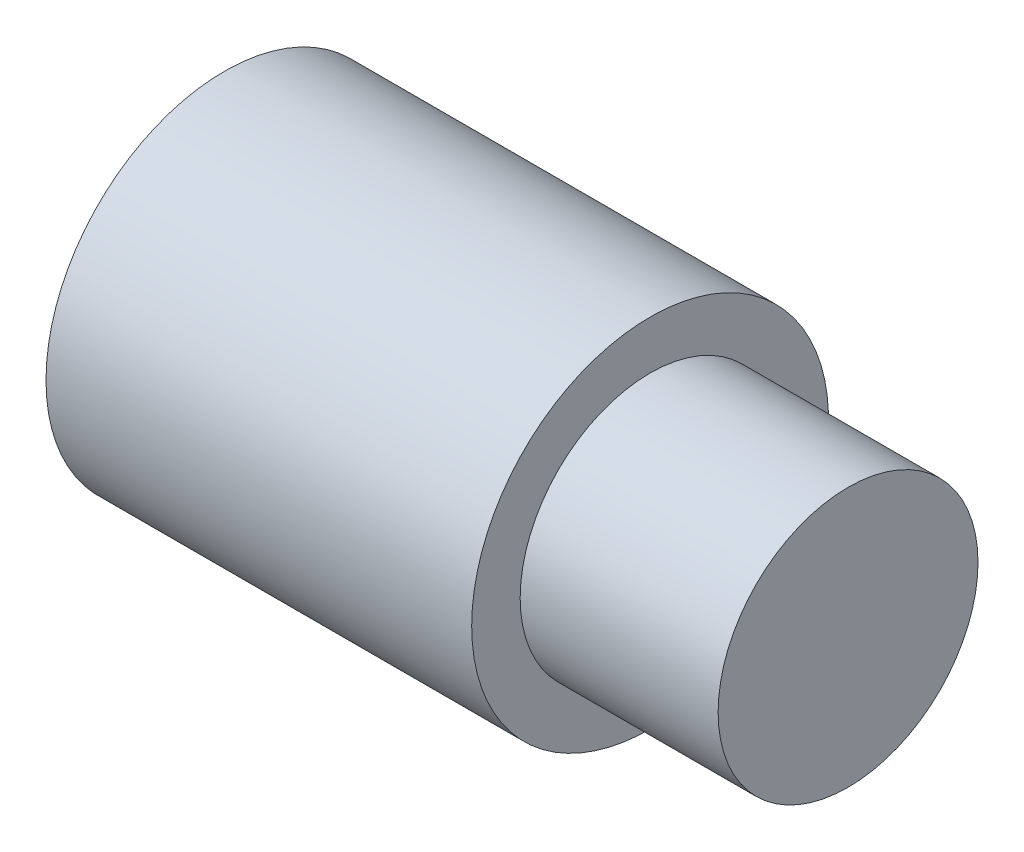
ISO-10303-21;
HEADER;
FILE_DESCRIPTION(('STEP AP214'),'2;1');
FILE_NAME('part.step','',(''),(''),'','','');
FILE_SCHEMA(('AUTOMOTIVE_DESIGN { 1 0 10303 214 1 1 1 1 }'));
ENDSEC;
DATA;
#1=APPLICATION_CONTEXT('core data for automotive mechanical design processes');
#2=APPLICATION_PROTOCOL_DEFINITION('international standard','automotive_design',2000,#1);
#3=PRODUCT_CONTEXT('',#1,'mechanical');
#4=PRODUCT('Part','Part','',(#3));
#5=PRODUCT_RELATED_PRODUCT_CATEGORY('part','',(#4));
#6=PRODUCT_DEFINITION_FORMATION('','',#4);
#7=PRODUCT_DEFINITION_CONTEXT('part definition',#1,'design');
#8=PRODUCT_DEFINITION('design','',#6,#7);
#9=PRODUCT_DEFINITION_SHAPE('','',#8);
#10=(LENGTH_UNIT() NAMED_UNIT(*) SI_UNIT(.MILLI.,.METRE.));
#11=(NAMED_UNIT(*) PLANE_ANGLE_UNIT() SI_UNIT($,.RADIAN.));
#12=(NAMED_UNIT(*) SI_UNIT($,.STERADIAN.) SOLID_ANGLE_UNIT());
#13=UNCERTAINTY_MEASURE_WITH_UNIT(LENGTH_MEASURE(1.E-05),#10,'distance_accuracy_value','');
#14=(GEOMETRIC_REPRESENTATION_CONTEXT(3) GLOBAL_UNCERTAINTY_ASSIGNED_CONTEXT((#13)) GLOBAL_UNIT_ASSIGNED_CONTEXT((#10,
#11,#12)) REPRESENTATION_CONTEXT('',''));
#15=CARTESIAN_POINT('',(0.,0.,0.));
#16=DIRECTION('',(0.,0.,1.));
#17=DIRECTION('',(1.,0.,0.));
#18=AXIS2_PLACEMENT_3D('',#15,#16,#17);
#19=CARTESIAN_POINT('',(13.3,0.,0.));
#20=DIRECTION('',(-1.,0.,0.));
#21=DIRECTION('',(0.,0.,1.));
#22=AXIS2_PLACEMENT_3D('',#19,#20,#21);
#23=PLANE('',#22);
#24=CARTESIAN_POINT('',(13.3000000000001,0.,0.));
#25=DIRECTION('',(-1.,0.,0.));
#26=DIRECTION('',(0.,0.,1.));
#27=AXIS2_PLACEMENT_3D('',#24,#25,#26);
#28=CIRCLE('',#27,8.73);
#29=CARTESIAN_POINT('',(13.3000000000001,0.,8.73));
#30=VERTEX_POINT('',#29);
#31=EDGE_CURVE('E10',#30,#30,#28,.T.);
#32=ORIENTED_EDGE('',*,*,#31,.F.);
#33=EDGE_LOOP('',(#32));
#34=FACE_BOUND('',#33,.T.);
#35=ADVANCED_FACE('F39',(#34),#23,.F.);
#36=CARTESIAN_POINT('',(-1000.,0.,0.));
#37=DIRECTION('',(-1.,0.,0.));
#38=DIRECTION('',(0.,0.,1.));
#39=AXIS2_PLACEMENT_3D('',#36,#37,#38);
#40=CYLINDRICAL_SURFACE('',#39,8.73);
#41=CARTESIAN_POINT('',(0.,0.,0.));
#42=DIRECTION('',(-1.,0.,0.));
#43=DIRECTION('',(0.,0.,1.));
#44=AXIS2_PLACEMENT_3D('',#41,#42,#43);
#45=CIRCLE('',#44,8.73);
#46=CARTESIAN_POINT('',(0.,0.,8.73));
#47=VERTEX_POINT('',#46);
#48=EDGE_CURVE('E46',#47,#47,#45,.T.);
#49=ORIENTED_EDGE('',*,*,#48,.F.);
#50=EDGE_LOOP('',(#49));
#51=FACE_BOUND('',#50,.T.);
#52=ORIENTED_EDGE('',*,*,#31,.T.);
#53=EDGE_LOOP('',(#52));
#54=FACE_BOUND('',#53,.T.);
#55=ADVANCED_FACE('F84',(#51,#54),#40,.T.);
#56=CARTESIAN_POINT('',(0.,8.73,0.));
#57=DIRECTION('',(-1.,0.,0.));
#58=DIRECTION('',(0.,0.,1.));
#59=AXIS2_PLACEMENT_3D('',#56,#57,#58);
#60=PLANE('',#59);
#61=CARTESIAN_POINT('',(0.,0.,0.));
#62=DIRECTION('',(-1.,0.,0.));
#63=DIRECTION('',(0.,0.,1.));
#64=AXIS2_PLACEMENT_3D('',#61,#62,#63);
#65=CIRCLE('',#64,11.988);
#66=CARTESIAN_POINT('',(0.,0.,11.988));
#67=VERTEX_POINT('',#66);
#68=EDGE_CURVE('E49',#67,#67,#65,.T.);
#69=ORIENTED_EDGE('',*,*,#68,.F.);
#70=EDGE_LOOP('',(#69));
#71=FACE_BOUND('',#70,.T.);
#72=ORIENTED_EDGE('',*,*,#48,.T.);
#73=EDGE_LOOP('',(#72));
#74=FACE_BOUND('',#73,.T.);
#75=ADVANCED_FACE('F76',(#71,#74),#60,.F.);
#76=CARTESIAN_POINT('',(-1000.,0.,0.));
#77=DIRECTION('',(-1.,0.,0.));
#78=DIRECTION('',(0.,0.,1.));
#79=AXIS2_PLACEMENT_3D('',#76,#77,#78);
#80=CYLINDRICAL_SURFACE('',#79,11.988);
#81=CARTESIAN_POINT('',(-28.6,0.,0.));
#82=DIRECTION('',(-1.,0.,0.));
#83=DIRECTION('',(0.,0.,1.));
#84=AXIS2_PLACEMENT_3D('',#81,#82,#83);
#85=CIRCLE('',#84,11.988);
#86=CARTESIAN_POINT('',(-28.6,0.,11.988));
#87=VERTEX_POINT('',#86);
#88=EDGE_CURVE('E54',#87,#87,#85,.T.);
#89=ORIENTED_EDGE('',*,*,#88,.F.);
#90=EDGE_LOOP('',(#89));
#91=FACE_BOUND('',#90,.T.);
#92=ORIENTED_EDGE('',*,*,#68,.T.);
#93=EDGE_LOOP('',(#92));
#94=FACE_BOUND('',#93,.T.);
#95=ADVANCED_FACE('F68',(#91,#94),#80,.T.);
#96=CARTESIAN_POINT('',(-28.6,11.988,0.));
#97=DIRECTION('',(1.,0.,0.));
#98=DIRECTION('',(0.,0.,-1.));
#99=AXIS2_PLACEMENT_3D('',#96,#97,#98);
#100=PLANE('',#99);
#101=CARTESIAN_POINT('',(-28.6,0.,0.));
#102=DIRECTION('',(1.,0.,0.));
#103=DIRECTION('',(0.,0.,-1.));
#104=AXIS2_PLACEMENT_3D('',#101,#102,#103);
#105=CIRCLE('',#104,6.35);
#106=CARTESIAN_POINT('',(-28.6,0.,-6.35));
#107=VERTEX_POINT('',#106);
#108=EDGE_CURVE('E45',#107,#107,#105,.F.);
#109=ORIENTED_EDGE('',*,*,#108,.F.);
#110=EDGE_LOOP('',(#109));
#111=FACE_BOUND('',#110,.T.);
#112=ORIENTED_EDGE('',*,*,#88,.T.);
#113=EDGE_LOOP('',(#112));
#114=FACE_BOUND('',#113,.T.);
#115=ADVANCED_FACE('F69',(#111,#114),#100,.F.);
#116=CARTESIAN_POINT('',(-1000.,0.,0.));
#117=DIRECTION('',(-1.,0.,0.));
#118=DIRECTION('',(0.,0.,1.));
#119=AXIS2_PLACEMENT_3D('',#116,#117,#118);
#120=CYLINDRICAL_SURFACE('',#119,6.35);
#121=CARTESIAN_POINT('',(-5.70000000000004,0.,0.));
#122=DIRECTION('',(-1.,0.,0.));
#123=DIRECTION('',(0.,0.,1.));
#124=AXIS2_PLACEMENT_3D('',#121,#122,#123);
#125=CIRCLE('',#124,6.35);
#126=CARTESIAN_POINT('',(-5.70000000000004,0.,6.35));
#127=VERTEX_POINT('',#126);
#128=EDGE_CURVE('E59',#127,#127,#125,.T.);
#129=ORIENTED_EDGE('',*,*,#128,.F.);
#130=EDGE_LOOP('',(#129));
#131=FACE_BOUND('',#130,.T.);
#132=ORIENTED_EDGE('',*,*,#108,.T.);
#133=EDGE_LOOP('',(#132));
#134=FACE_BOUND('',#133,.T.);
#135=ADVANCED_FACE('F64',(#131,#134),#120,.F.);
#136=CARTESIAN_POINT('',(-5.7,6.35,0.));
#137=DIRECTION('',(-1.,0.,0.));
#138=DIRECTION('',(0.,0.,1.));
#139=AXIS2_PLACEMENT_3D('',#136,#137,#138);
#140=PLANE('',#139);
#141=ORIENTED_EDGE('',*,*,#128,.T.);
#142=EDGE_LOOP('',(#141));
#143=FACE_BOUND('',#142,.T.);
#144=ADVANCED_FACE('F94',(#143),#140,.T.);
#145=CLOSED_SHELL('',(#35,#55,#75,#95,#115,#135,#144));
#146=MANIFOLD_SOLID_BREP('B2',#145);
#147=ADVANCED_BREP_SHAPE_REPRESENTATION('',(#18,#146),#14);
#148=SHAPE_DEFINITION_REPRESENTATION(#9,#147);
ENDSEC;
END-ISO-10303-21;
